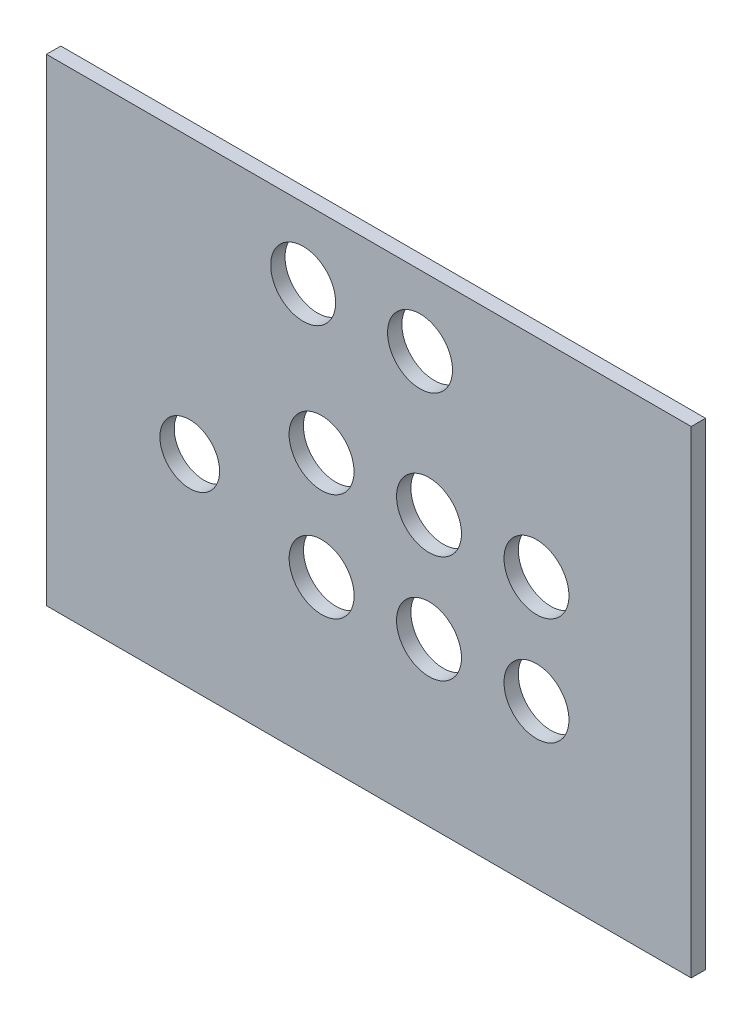
ISO-10303-21;
HEADER;
FILE_DESCRIPTION(('STEP AP214'),'2;1');
FILE_NAME('part.step','',(''),(''),'','','');
FILE_SCHEMA(('AUTOMOTIVE_DESIGN { 1 0 10303 214 1 1 1 1 }'));
ENDSEC;
DATA;
#1=APPLICATION_CONTEXT('core data for automotive mechanical design processes');
#2=APPLICATION_PROTOCOL_DEFINITION('international standard','automotive_design',2000,#1);
#3=PRODUCT_CONTEXT('',#1,'mechanical');
#4=PRODUCT('Part','Part','',(#3));
#5=PRODUCT_RELATED_PRODUCT_CATEGORY('part','',(#4));
#6=PRODUCT_DEFINITION_FORMATION('','',#4);
#7=PRODUCT_DEFINITION_CONTEXT('part definition',#1,'design');
#8=PRODUCT_DEFINITION('design','',#6,#7);
#9=PRODUCT_DEFINITION_SHAPE('','',#8);
#10=(LENGTH_UNIT() NAMED_UNIT(*) SI_UNIT(.MILLI.,.METRE.));
#11=(NAMED_UNIT(*) PLANE_ANGLE_UNIT() SI_UNIT($,.RADIAN.));
#12=(NAMED_UNIT(*) SI_UNIT($,.STERADIAN.) SOLID_ANGLE_UNIT());
#13=UNCERTAINTY_MEASURE_WITH_UNIT(LENGTH_MEASURE(1.E-05),#10,'distance_accuracy_value','');
#14=(GEOMETRIC_REPRESENTATION_CONTEXT(3) GLOBAL_UNCERTAINTY_ASSIGNED_CONTEXT((#13)) GLOBAL_UNIT_ASSIGNED_CONTEXT((#10,
#11,#12)) REPRESENTATION_CONTEXT('',''));
#15=CARTESIAN_POINT('',(0.,0.,0.));
#16=DIRECTION('',(0.,0.,1.));
#17=DIRECTION('',(1.,0.,0.));
#18=AXIS2_PLACEMENT_3D('',#15,#16,#17);
#19=CARTESIAN_POINT('',(0.,0.,6.));
#20=DIRECTION('',(0.,0.,1.));
#21=DIRECTION('',(1.,0.,0.));
#22=AXIS2_PLACEMENT_3D('',#19,#20,#21);
#23=PLANE('',#22);
#24=CARTESIAN_POINT('',(-162.5,170.497194252676,6.));
#25=DIRECTION('',(0.,0.,1.));
#26=DIRECTION('',(1.,0.,0.));
#27=AXIS2_PLACEMENT_3D('',#24,#25,#26);
#28=CIRCLE('',#27,13.6);
#29=CARTESIAN_POINT('',(-148.9,170.497194252676,6.));
#30=VERTEX_POINT('',#29);
#31=EDGE_CURVE('E151',#30,#30,#28,.T.);
#32=ORIENTED_EDGE('',*,*,#31,.F.);
#33=EDGE_LOOP('',(#32));
#34=FACE_BOUND('',#33,.T.);
#35=CARTESIAN_POINT('',(-109.803249076877,68.0002749385065,6.));
#36=DIRECTION('',(0.,0.,1.));
#37=DIRECTION('',(1.,0.,0.));
#38=AXIS2_PLACEMENT_3D('',#35,#36,#37);
#39=CIRCLE('',#38,13.6);
#40=CARTESIAN_POINT('',(-96.2032490768771,68.0002749385065,6.));
#41=VERTEX_POINT('',#40);
#42=EDGE_CURVE('E139',#41,#41,#39,.T.);
#43=ORIENTED_EDGE('',*,*,#42,.F.);
#44=EDGE_LOOP('',(#43));
#45=FACE_BOUND('',#44,.T.);
#46=CARTESIAN_POINT('',(-64.8032509999034,113.,6.));
#47=DIRECTION('',(0.,0.,1.));
#48=DIRECTION('',(1.,0.,0.));
#49=AXIS2_PLACEMENT_3D('',#46,#47,#48);
#50=CIRCLE('',#49,13.6);
#51=CARTESIAN_POINT('',(-51.2032509999034,113.,6.));
#52=VERTEX_POINT('',#51);
#53=EDGE_CURVE('E127',#52,#52,#50,.T.);
#54=ORIENTED_EDGE('',*,*,#53,.F.);
#55=EDGE_LOOP('',(#54));
#56=FACE_BOUND('',#55,.T.);
#57=CARTESIAN_POINT('',(-154.803247065451,113.000298981441,6.));
#58=DIRECTION('',(0.,0.,1.));
#59=DIRECTION('',(1.,0.,0.));
#60=AXIS2_PLACEMENT_3D('',#57,#58,#59);
#61=CIRCLE('',#60,13.6);
#62=CARTESIAN_POINT('',(-141.203247065451,113.000298981441,6.));
#63=VERTEX_POINT('',#62);
#64=EDGE_CURVE('E115',#63,#63,#61,.T.);
#65=ORIENTED_EDGE('',*,*,#64,.F.);
#66=EDGE_LOOP('',(#65));
#67=FACE_BOUND('',#66,.T.);
#68=DIRECTION('',(1.,0.,0.));
#69=VECTOR('',#68,1.);
#70=CARTESIAN_POINT('',(-270.,0.,6.));
#71=LINE('',#70,#69);
#72=CARTESIAN_POINT('',(-270.,0.,6.));
#73=VERTEX_POINT('',#72);
#74=CARTESIAN_POINT('',(0.,0.,6.));
#75=VERTEX_POINT('',#74);
#76=EDGE_CURVE('E85',#73,#75,#71,.T.);
#77=ORIENTED_EDGE('',*,*,#76,.T.);
#78=DIRECTION('',(0.,1.,0.));
#79=VECTOR('',#78,1.);
#80=CARTESIAN_POINT('',(0.,0.,6.));
#81=LINE('',#80,#79);
#82=CARTESIAN_POINT('',(0.,200.,6.));
#83=VERTEX_POINT('',#82);
#84=EDGE_CURVE('E80',#75,#83,#81,.T.);
#85=ORIENTED_EDGE('',*,*,#84,.T.);
#86=DIRECTION('',(-1.,0.,0.));
#87=VECTOR('',#86,1.);
#88=CARTESIAN_POINT('',(0.,200.,6.));
#89=LINE('',#88,#87);
#90=CARTESIAN_POINT('',(-270.,200.,6.));
#91=VERTEX_POINT('',#90);
#92=EDGE_CURVE('E83',#83,#91,#89,.T.);
#93=ORIENTED_EDGE('',*,*,#92,.T.);
#94=DIRECTION('',(0.,-1.,0.));
#95=VECTOR('',#94,1.);
#96=CARTESIAN_POINT('',(-270.,200.,6.));
#97=LINE('',#96,#95);
#98=EDGE_CURVE('E50',#91,#73,#97,.T.);
#99=ORIENTED_EDGE('',*,*,#98,.T.);
#100=EDGE_LOOP('',(#77,#85,#93,#99));
#101=FACE_BOUND('',#100,.T.);
#102=CARTESIAN_POINT('',(-210.,85.,6.));
#103=DIRECTION('',(0.,0.,1.));
#104=DIRECTION('',(1.,0.,0.));
#105=AXIS2_PLACEMENT_3D('',#102,#103,#104);
#106=CIRCLE('',#105,12.5);
#107=CARTESIAN_POINT('',(-197.5,85.,6.));
#108=VERTEX_POINT('',#107);
#109=EDGE_CURVE('E100',#108,#108,#106,.T.);
#110=ORIENTED_EDGE('',*,*,#109,.F.);
#111=EDGE_LOOP('',(#110));
#112=FACE_BOUND('',#111,.T.);
#113=CARTESIAN_POINT('',(-109.803249076877,112.986844303259,6.));
#114=DIRECTION('',(0.,0.,1.));
#115=DIRECTION('',(1.,0.,0.));
#116=AXIS2_PLACEMENT_3D('',#113,#114,#115);
#117=CIRCLE('',#116,13.6);
#118=CARTESIAN_POINT('',(-96.2032490768771,112.986844303259,6.));
#119=VERTEX_POINT('',#118);
#120=EDGE_CURVE('E121',#119,#119,#117,.T.);
#121=ORIENTED_EDGE('',*,*,#120,.F.);
#122=EDGE_LOOP('',(#121));
#123=FACE_BOUND('',#122,.T.);
#124=CARTESIAN_POINT('',(-154.774507715446,68.0003081586666,6.));
#125=DIRECTION('',(0.,0.,1.));
#126=DIRECTION('',(1.,0.,0.));
#127=AXIS2_PLACEMENT_3D('',#124,#125,#126);
#128=CIRCLE('',#127,13.6);
#129=CARTESIAN_POINT('',(-141.174507715446,68.0003081586666,6.));
#130=VERTEX_POINT('',#129);
#131=EDGE_CURVE('E133',#130,#130,#128,.T.);
#132=ORIENTED_EDGE('',*,*,#131,.F.);
#133=EDGE_LOOP('',(#132));
#134=FACE_BOUND('',#133,.T.);
#135=CARTESIAN_POINT('',(-64.8032509999034,68.0002749385065,6.));
#136=DIRECTION('',(0.,0.,1.));
#137=DIRECTION('',(1.,0.,0.));
#138=AXIS2_PLACEMENT_3D('',#135,#136,#137);
#139=CIRCLE('',#138,13.6);
#140=CARTESIAN_POINT('',(-51.2032509999034,68.0002749385065,6.));
#141=VERTEX_POINT('',#140);
#142=EDGE_CURVE('E145',#141,#141,#139,.T.);
#143=ORIENTED_EDGE('',*,*,#142,.F.);
#144=EDGE_LOOP('',(#143));
#145=FACE_BOUND('',#144,.T.);
#146=CARTESIAN_POINT('',(-113.572015699737,170.497194252676,6.));
#147=DIRECTION('',(0.,0.,1.));
#148=DIRECTION('',(1.,0.,0.));
#149=AXIS2_PLACEMENT_3D('',#146,#147,#148);
#150=CIRCLE('',#149,13.6);
#151=CARTESIAN_POINT('',(-99.9720156997366,170.497194252676,6.));
#152=VERTEX_POINT('',#151);
#153=EDGE_CURVE('E157',#152,#152,#150,.T.);
#154=ORIENTED_EDGE('',*,*,#153,.F.);
#155=EDGE_LOOP('',(#154));
#156=FACE_BOUND('',#155,.T.);
#157=ADVANCED_FACE('F33',(#34,#45,#56,#67,#101,#112,#123,#134,#145,#156),#23,.T.);
#158=CARTESIAN_POINT('',(0.,0.,0.));
#159=DIRECTION('',(0.,0.,1.));
#160=DIRECTION('',(1.,0.,0.));
#161=AXIS2_PLACEMENT_3D('',#158,#159,#160);
#162=PLANE('',#161);
#163=DIRECTION('',(1.,0.,0.));
#164=VECTOR('',#163,1.);
#165=CARTESIAN_POINT('',(-270.,0.,0.));
#166=LINE('',#165,#164);
#167=CARTESIAN_POINT('',(-270.,0.,0.));
#168=VERTEX_POINT('',#167);
#169=CARTESIAN_POINT('',(0.,0.,0.));
#170=VERTEX_POINT('',#169);
#171=EDGE_CURVE('E97',#168,#170,#166,.T.);
#172=ORIENTED_EDGE('',*,*,#171,.F.);
#173=DIRECTION('',(0.,-1.,0.));
#174=VECTOR('',#173,1.);
#175=CARTESIAN_POINT('',(-270.,200.,0.));
#176=LINE('',#175,#174);
#177=CARTESIAN_POINT('',(-270.,200.,0.));
#178=VERTEX_POINT('',#177);
#179=EDGE_CURVE('E73',#178,#168,#176,.T.);
#180=ORIENTED_EDGE('',*,*,#179,.F.);
#181=DIRECTION('',(-1.,0.,0.));
#182=VECTOR('',#181,1.);
#183=CARTESIAN_POINT('',(0.,200.,0.));
#184=LINE('',#183,#182);
#185=CARTESIAN_POINT('',(0.,200.,0.));
#186=VERTEX_POINT('',#185);
#187=EDGE_CURVE('E67',#186,#178,#184,.T.);
#188=ORIENTED_EDGE('',*,*,#187,.F.);
#189=DIRECTION('',(0.,1.,0.));
#190=VECTOR('',#189,1.);
#191=CARTESIAN_POINT('',(0.,0.,0.));
#192=LINE('',#191,#190);
#193=EDGE_CURVE('E89',#170,#186,#192,.T.);
#194=ORIENTED_EDGE('',*,*,#193,.F.);
#195=EDGE_LOOP('',(#172,#180,#188,#194));
#196=FACE_BOUND('',#195,.T.);
#197=CARTESIAN_POINT('',(-210.,85.,0.));
#198=DIRECTION('',(0.,0.,1.));
#199=DIRECTION('',(1.,0.,0.));
#200=AXIS2_PLACEMENT_3D('',#197,#198,#199);
#201=CIRCLE('',#200,12.5);
#202=CARTESIAN_POINT('',(-197.5,85.,0.));
#203=VERTEX_POINT('',#202);
#204=EDGE_CURVE('E112',#203,#203,#201,.T.);
#205=ORIENTED_EDGE('',*,*,#204,.T.);
#206=EDGE_LOOP('',(#205));
#207=FACE_BOUND('',#206,.T.);
#208=CARTESIAN_POINT('',(-154.803247065451,113.000298981441,0.));
#209=DIRECTION('',(0.,0.,1.));
#210=DIRECTION('',(1.,0.,0.));
#211=AXIS2_PLACEMENT_3D('',#208,#209,#210);
#212=CIRCLE('',#211,13.6);
#213=CARTESIAN_POINT('',(-141.203247065451,113.000298981441,0.));
#214=VERTEX_POINT('',#213);
#215=EDGE_CURVE('E118',#214,#214,#212,.T.);
#216=ORIENTED_EDGE('',*,*,#215,.T.);
#217=EDGE_LOOP('',(#216));
#218=FACE_BOUND('',#217,.T.);
#219=CARTESIAN_POINT('',(-109.803249076877,112.986844303259,0.));
#220=DIRECTION('',(0.,0.,1.));
#221=DIRECTION('',(1.,0.,0.));
#222=AXIS2_PLACEMENT_3D('',#219,#220,#221);
#223=CIRCLE('',#222,13.6);
#224=CARTESIAN_POINT('',(-96.2032490768771,112.986844303259,0.));
#225=VERTEX_POINT('',#224);
#226=EDGE_CURVE('E124',#225,#225,#223,.T.);
#227=ORIENTED_EDGE('',*,*,#226,.T.);
#228=EDGE_LOOP('',(#227));
#229=FACE_BOUND('',#228,.T.);
#230=CARTESIAN_POINT('',(-64.8032509999034,113.,0.));
#231=DIRECTION('',(0.,0.,1.));
#232=DIRECTION('',(1.,0.,0.));
#233=AXIS2_PLACEMENT_3D('',#230,#231,#232);
#234=CIRCLE('',#233,13.6);
#235=CARTESIAN_POINT('',(-51.2032509999034,113.,0.));
#236=VERTEX_POINT('',#235);
#237=EDGE_CURVE('E130',#236,#236,#234,.T.);
#238=ORIENTED_EDGE('',*,*,#237,.T.);
#239=EDGE_LOOP('',(#238));
#240=FACE_BOUND('',#239,.T.);
#241=CARTESIAN_POINT('',(-154.774507715446,68.0003081586666,0.));
#242=DIRECTION('',(0.,0.,1.));
#243=DIRECTION('',(1.,0.,0.));
#244=AXIS2_PLACEMENT_3D('',#241,#242,#243);
#245=CIRCLE('',#244,13.6);
#246=CARTESIAN_POINT('',(-141.174507715446,68.0003081586666,0.));
#247=VERTEX_POINT('',#246);
#248=EDGE_CURVE('E136',#247,#247,#245,.T.);
#249=ORIENTED_EDGE('',*,*,#248,.T.);
#250=EDGE_LOOP('',(#249));
#251=FACE_BOUND('',#250,.T.);
#252=CARTESIAN_POINT('',(-109.803249076877,68.0002749385065,0.));
#253=DIRECTION('',(0.,0.,1.));
#254=DIRECTION('',(1.,0.,0.));
#255=AXIS2_PLACEMENT_3D('',#252,#253,#254);
#256=CIRCLE('',#255,13.6);
#257=CARTESIAN_POINT('',(-96.2032490768771,68.0002749385065,0.));
#258=VERTEX_POINT('',#257);
#259=EDGE_CURVE('E142',#258,#258,#256,.T.);
#260=ORIENTED_EDGE('',*,*,#259,.T.);
#261=EDGE_LOOP('',(#260));
#262=FACE_BOUND('',#261,.T.);
#263=CARTESIAN_POINT('',(-64.8032509999034,68.0002749385065,0.));
#264=DIRECTION('',(0.,0.,1.));
#265=DIRECTION('',(1.,0.,0.));
#266=AXIS2_PLACEMENT_3D('',#263,#264,#265);
#267=CIRCLE('',#266,13.6);
#268=CARTESIAN_POINT('',(-51.2032509999034,68.0002749385065,0.));
#269=VERTEX_POINT('',#268);
#270=EDGE_CURVE('E148',#269,#269,#267,.T.);
#271=ORIENTED_EDGE('',*,*,#270,.T.);
#272=EDGE_LOOP('',(#271));
#273=FACE_BOUND('',#272,.T.);
#274=CARTESIAN_POINT('',(-162.5,170.497194252676,0.));
#275=DIRECTION('',(0.,0.,1.));
#276=DIRECTION('',(1.,0.,0.));
#277=AXIS2_PLACEMENT_3D('',#274,#275,#276);
#278=CIRCLE('',#277,13.6);
#279=CARTESIAN_POINT('',(-148.9,170.497194252676,0.));
#280=VERTEX_POINT('',#279);
#281=EDGE_CURVE('E154',#280,#280,#278,.T.);
#282=ORIENTED_EDGE('',*,*,#281,.T.);
#283=EDGE_LOOP('',(#282));
#284=FACE_BOUND('',#283,.T.);
#285=CARTESIAN_POINT('',(-113.572015699737,170.497194252676,0.));
#286=DIRECTION('',(0.,0.,1.));
#287=DIRECTION('',(1.,0.,0.));
#288=AXIS2_PLACEMENT_3D('',#285,#286,#287);
#289=CIRCLE('',#288,13.6);
#290=CARTESIAN_POINT('',(-99.9720156997366,170.497194252676,0.));
#291=VERTEX_POINT('',#290);
#292=EDGE_CURVE('E160',#291,#291,#289,.T.);
#293=ORIENTED_EDGE('',*,*,#292,.T.);
#294=EDGE_LOOP('',(#293));
#295=FACE_BOUND('',#294,.T.);
#296=ADVANCED_FACE('F108',(#196,#207,#218,#229,#240,#251,#262,#273,#284,#295),#162,.F.);
#297=CARTESIAN_POINT('',(-270.,0.,6.));
#298=DIRECTION('',(0.,1.,0.));
#299=DIRECTION('',(0.,0.,1.));
#300=AXIS2_PLACEMENT_3D('',#297,#298,#299);
#301=PLANE('',#300);
#302=ORIENTED_EDGE('',*,*,#171,.T.);
#303=DIRECTION('',(0.,0.,-1.));
#304=VECTOR('',#303,1.);
#305=CARTESIAN_POINT('',(0.,0.,6.));
#306=LINE('',#305,#304);
#307=EDGE_CURVE('E11',#75,#170,#306,.T.);
#308=ORIENTED_EDGE('',*,*,#307,.F.);
#309=ORIENTED_EDGE('',*,*,#76,.F.);
#310=DIRECTION('',(0.,0.,-1.));
#311=VECTOR('',#310,1.);
#312=CARTESIAN_POINT('',(-270.,0.,6.));
#313=LINE('',#312,#311);
#314=EDGE_CURVE('E93',#73,#168,#313,.T.);
#315=ORIENTED_EDGE('',*,*,#314,.T.);
#316=EDGE_LOOP('',(#302,#308,#309,#315));
#317=FACE_BOUND('',#316,.T.);
#318=ADVANCED_FACE('F35',(#317),#301,.F.);
#319=CARTESIAN_POINT('',(0.,0.,6.));
#320=DIRECTION('',(-1.,0.,0.));
#321=DIRECTION('',(0.,0.,1.));
#322=AXIS2_PLACEMENT_3D('',#319,#320,#321);
#323=PLANE('',#322);
#324=ORIENTED_EDGE('',*,*,#193,.T.);
#325=DIRECTION('',(0.,0.,-1.));
#326=VECTOR('',#325,1.);
#327=CARTESIAN_POINT('',(0.,200.,6.));
#328=LINE('',#327,#326);
#329=EDGE_CURVE('E42',#83,#186,#328,.T.);
#330=ORIENTED_EDGE('',*,*,#329,.F.);
#331=ORIENTED_EDGE('',*,*,#84,.F.);
#332=ORIENTED_EDGE('',*,*,#307,.T.);
#333=EDGE_LOOP('',(#324,#330,#331,#332));
#334=FACE_BOUND('',#333,.T.);
#335=ADVANCED_FACE('F88',(#334),#323,.F.);
#336=CARTESIAN_POINT('',(0.,200.,6.));
#337=DIRECTION('',(0.,-1.,0.));
#338=DIRECTION('',(0.,0.,-1.));
#339=AXIS2_PLACEMENT_3D('',#336,#337,#338);
#340=PLANE('',#339);
#341=ORIENTED_EDGE('',*,*,#187,.T.);
#342=DIRECTION('',(0.,0.,-1.));
#343=VECTOR('',#342,1.);
#344=CARTESIAN_POINT('',(-270.,200.,6.));
#345=LINE('',#344,#343);
#346=EDGE_CURVE('E90',#91,#178,#345,.T.);
#347=ORIENTED_EDGE('',*,*,#346,.F.);
#348=ORIENTED_EDGE('',*,*,#92,.F.);
#349=ORIENTED_EDGE('',*,*,#329,.T.);
#350=EDGE_LOOP('',(#341,#347,#348,#349));
#351=FACE_BOUND('',#350,.T.);
#352=ADVANCED_FACE('F91',(#351),#340,.F.);
#353=CARTESIAN_POINT('',(-270.,200.,6.));
#354=DIRECTION('',(1.,0.,0.));
#355=DIRECTION('',(0.,0.,-1.));
#356=AXIS2_PLACEMENT_3D('',#353,#354,#355);
#357=PLANE('',#356);
#358=ORIENTED_EDGE('',*,*,#179,.T.);
#359=ORIENTED_EDGE('',*,*,#314,.F.);
#360=ORIENTED_EDGE('',*,*,#98,.F.);
#361=ORIENTED_EDGE('',*,*,#346,.T.);
#362=EDGE_LOOP('',(#358,#359,#360,#361));
#363=FACE_BOUND('',#362,.T.);
#364=ADVANCED_FACE('F105',(#363),#357,.F.);
#365=CARTESIAN_POINT('',(-210.,85.,6.));
#366=DIRECTION('',(0.,0.,-1.));
#367=DIRECTION('',(-1.,0.,0.));
#368=AXIS2_PLACEMENT_3D('',#365,#366,#367);
#369=CYLINDRICAL_SURFACE('',#368,12.5);
#370=ORIENTED_EDGE('',*,*,#109,.T.);
#371=EDGE_LOOP('',(#370));
#372=FACE_BOUND('',#371,.T.);
#373=ORIENTED_EDGE('',*,*,#204,.F.);
#374=EDGE_LOOP('',(#373));
#375=FACE_BOUND('',#374,.T.);
#376=ADVANCED_FACE('F179',(#372,#375),#369,.F.);
#377=CARTESIAN_POINT('',(-154.803247065451,113.000298981441,6.));
#378=DIRECTION('',(0.,0.,-1.));
#379=DIRECTION('',(-1.,0.,0.));
#380=AXIS2_PLACEMENT_3D('',#377,#378,#379);
#381=CYLINDRICAL_SURFACE('',#380,13.6);
#382=ORIENTED_EDGE('',*,*,#64,.T.);
#383=EDGE_LOOP('',(#382));
#384=FACE_BOUND('',#383,.T.);
#385=ORIENTED_EDGE('',*,*,#215,.F.);
#386=EDGE_LOOP('',(#385));
#387=FACE_BOUND('',#386,.T.);
#388=ADVANCED_FACE('F225',(#384,#387),#381,.F.);
#389=CARTESIAN_POINT('',(-109.803249076877,112.986844303259,6.));
#390=DIRECTION('',(0.,0.,-1.));
#391=DIRECTION('',(-1.,0.,0.));
#392=AXIS2_PLACEMENT_3D('',#389,#390,#391);
#393=CYLINDRICAL_SURFACE('',#392,13.6);
#394=ORIENTED_EDGE('',*,*,#120,.T.);
#395=EDGE_LOOP('',(#394));
#396=FACE_BOUND('',#395,.T.);
#397=ORIENTED_EDGE('',*,*,#226,.F.);
#398=EDGE_LOOP('',(#397));
#399=FACE_BOUND('',#398,.T.);
#400=ADVANCED_FACE('F233',(#396,#399),#393,.F.);
#401=CARTESIAN_POINT('',(-64.8032509999034,113.,6.));
#402=DIRECTION('',(0.,0.,-1.));
#403=DIRECTION('',(-1.,0.,0.));
#404=AXIS2_PLACEMENT_3D('',#401,#402,#403);
#405=CYLINDRICAL_SURFACE('',#404,13.6);
#406=ORIENTED_EDGE('',*,*,#53,.T.);
#407=EDGE_LOOP('',(#406));
#408=FACE_BOUND('',#407,.T.);
#409=ORIENTED_EDGE('',*,*,#237,.F.);
#410=EDGE_LOOP('',(#409));
#411=FACE_BOUND('',#410,.T.);
#412=ADVANCED_FACE('F241',(#408,#411),#405,.F.);
#413=CARTESIAN_POINT('',(-154.774507715446,68.0003081586666,6.));
#414=DIRECTION('',(0.,0.,-1.));
#415=DIRECTION('',(-1.,0.,0.));
#416=AXIS2_PLACEMENT_3D('',#413,#414,#415);
#417=CYLINDRICAL_SURFACE('',#416,13.6);
#418=ORIENTED_EDGE('',*,*,#131,.T.);
#419=EDGE_LOOP('',(#418));
#420=FACE_BOUND('',#419,.T.);
#421=ORIENTED_EDGE('',*,*,#248,.F.);
#422=EDGE_LOOP('',(#421));
#423=FACE_BOUND('',#422,.T.);
#424=ADVANCED_FACE('F250',(#420,#423),#417,.F.);
#425=CARTESIAN_POINT('',(-109.803249076877,68.0002749385065,6.));
#426=DIRECTION('',(0.,0.,-1.));
#427=DIRECTION('',(-1.,0.,0.));
#428=AXIS2_PLACEMENT_3D('',#425,#426,#427);
#429=CYLINDRICAL_SURFACE('',#428,13.6);
#430=ORIENTED_EDGE('',*,*,#42,.T.);
#431=EDGE_LOOP('',(#430));
#432=FACE_BOUND('',#431,.T.);
#433=ORIENTED_EDGE('',*,*,#259,.F.);
#434=EDGE_LOOP('',(#433));
#435=FACE_BOUND('',#434,.T.);
#436=ADVANCED_FACE('F259',(#432,#435),#429,.F.);
#437=CARTESIAN_POINT('',(-64.8032509999034,68.0002749385065,6.));
#438=DIRECTION('',(0.,0.,-1.));
#439=DIRECTION('',(-1.,0.,0.));
#440=AXIS2_PLACEMENT_3D('',#437,#438,#439);
#441=CYLINDRICAL_SURFACE('',#440,13.6);
#442=ORIENTED_EDGE('',*,*,#142,.T.);
#443=EDGE_LOOP('',(#442));
#444=FACE_BOUND('',#443,.T.);
#445=ORIENTED_EDGE('',*,*,#270,.F.);
#446=EDGE_LOOP('',(#445));
#447=FACE_BOUND('',#446,.T.);
#448=ADVANCED_FACE('F268',(#444,#447),#441,.F.);
#449=CARTESIAN_POINT('',(-162.5,170.497194252676,6.));
#450=DIRECTION('',(0.,0.,-1.));
#451=DIRECTION('',(-1.,0.,0.));
#452=AXIS2_PLACEMENT_3D('',#449,#450,#451);
#453=CYLINDRICAL_SURFACE('',#452,13.6);
#454=ORIENTED_EDGE('',*,*,#31,.T.);
#455=EDGE_LOOP('',(#454));
#456=FACE_BOUND('',#455,.T.);
#457=ORIENTED_EDGE('',*,*,#281,.F.);
#458=EDGE_LOOP('',(#457));
#459=FACE_BOUND('',#458,.T.);
#460=ADVANCED_FACE('F277',(#456,#459),#453,.F.);
#461=CARTESIAN_POINT('',(-113.572015699737,170.497194252676,6.));
#462=DIRECTION('',(0.,0.,-1.));
#463=DIRECTION('',(-1.,0.,0.));
#464=AXIS2_PLACEMENT_3D('',#461,#462,#463);
#465=CYLINDRICAL_SURFACE('',#464,13.6);
#466=ORIENTED_EDGE('',*,*,#153,.T.);
#467=EDGE_LOOP('',(#466));
#468=FACE_BOUND('',#467,.T.);
#469=ORIENTED_EDGE('',*,*,#292,.F.);
#470=EDGE_LOOP('',(#469));
#471=FACE_BOUND('',#470,.T.);
#472=ADVANCED_FACE('F166',(#468,#471),#465,.F.);
#473=CLOSED_SHELL('',(#157,#296,#318,#335,#352,#364,#376,#388,#400,#412,#424,#436,#448,#460,#472));
#474=MANIFOLD_SOLID_BREP('B2',#473);
#475=ADVANCED_BREP_SHAPE_REPRESENTATION('',(#18,#474),#14);
#476=SHAPE_DEFINITION_REPRESENTATION(#9,#475);
ENDSEC;
END-ISO-10303-21;
